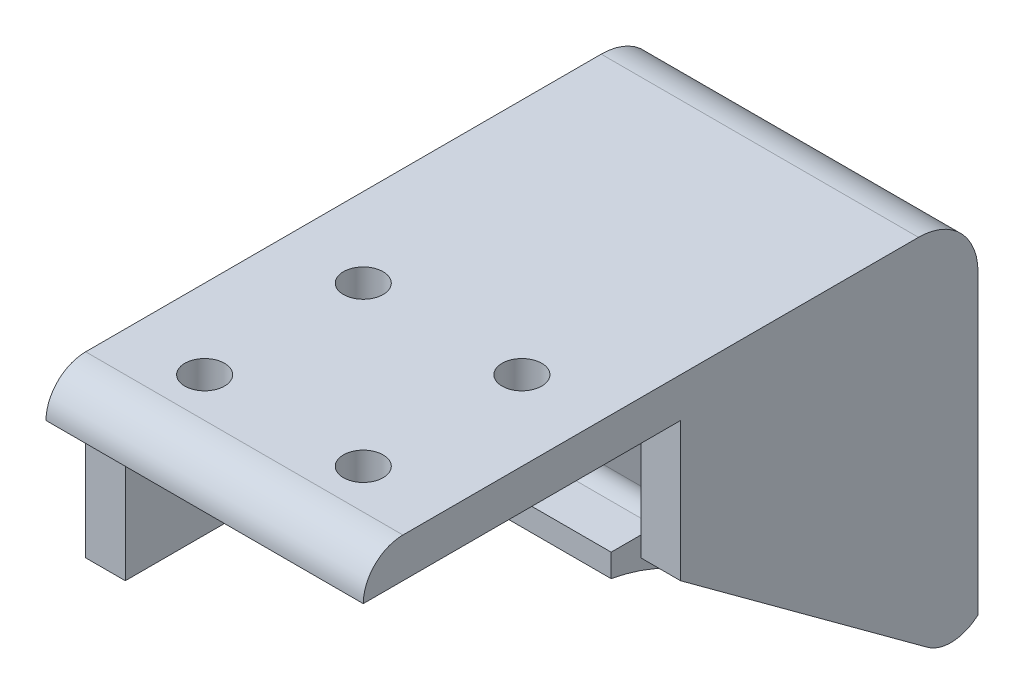
ISO-10303-21;
HEADER;
FILE_DESCRIPTION(('STEP AP214'),'2;1');
FILE_NAME('part.step','',(''),(''),'','','');
FILE_SCHEMA(('AUTOMOTIVE_DESIGN { 1 0 10303 214 1 1 1 1 }'));
ENDSEC;
DATA;
#1=APPLICATION_CONTEXT('core data for automotive mechanical design processes');
#2=APPLICATION_PROTOCOL_DEFINITION('international standard','automotive_design',2000,#1);
#3=PRODUCT_CONTEXT('',#1,'mechanical');
#4=PRODUCT('Part','Part','',(#3));
#5=PRODUCT_RELATED_PRODUCT_CATEGORY('part','',(#4));
#6=PRODUCT_DEFINITION_FORMATION('','',#4);
#7=PRODUCT_DEFINITION_CONTEXT('part definition',#1,'design');
#8=PRODUCT_DEFINITION('design','',#6,#7);
#9=PRODUCT_DEFINITION_SHAPE('','',#8);
#10=(LENGTH_UNIT() NAMED_UNIT(*) SI_UNIT(.MILLI.,.METRE.));
#11=(NAMED_UNIT(*) PLANE_ANGLE_UNIT() SI_UNIT($,.RADIAN.));
#12=(NAMED_UNIT(*) SI_UNIT($,.STERADIAN.) SOLID_ANGLE_UNIT());
#13=UNCERTAINTY_MEASURE_WITH_UNIT(LENGTH_MEASURE(1.E-05),#10,'distance_accuracy_value','');
#14=(GEOMETRIC_REPRESENTATION_CONTEXT(3) GLOBAL_UNCERTAINTY_ASSIGNED_CONTEXT((#13)) GLOBAL_UNIT_ASSIGNED_CONTEXT((#10,
#11,#12)) REPRESENTATION_CONTEXT('',''));
#15=CARTESIAN_POINT('',(0.,0.,0.));
#16=DIRECTION('',(0.,0.,1.));
#17=DIRECTION('',(1.,0.,0.));
#18=AXIS2_PLACEMENT_3D('',#15,#16,#17);
#19=CARTESIAN_POINT('',(0.,-13.0057803468208,-9.53757225433528));
#20=DIRECTION('',(0.,0.806404995855705,0.591363663627518));
#21=DIRECTION('',(0.,-0.591363663627518,0.806404995855705));
#22=AXIS2_PLACEMENT_3D('',#19,#20,#21);
#23=PLANE('',#22);
#24=DIRECTION('',(0.,-0.591363663627518,0.806404995855705));
#25=VECTOR('',#24,1.);
#26=CARTESIAN_POINT('',(16.,-13.0057803468208,-9.53757225433528));
#27=LINE('',#26,#25);
#28=CARTESIAN_POINT('',(16.,-9.,-15.));
#29=VERTEX_POINT('',#28);
#30=CARTESIAN_POINT('',(16.,-9.13266662667964,-14.8190909636187));
#31=VERTEX_POINT('',#30);
#32=EDGE_CURVE('E207',#29,#31,#27,.T.);
#33=ORIENTED_EDGE('',*,*,#32,.T.);
#34=DIRECTION('',(1.,0.,0.));
#35=VECTOR('',#34,1.);
#36=CARTESIAN_POINT('',(0.,-9.13266662667964,-14.8190909636187));
#37=LINE('',#36,#35);
#38=CARTESIAN_POINT('',(14.,-9.13266662667963,-14.8190909636187));
#39=VERTEX_POINT('',#38);
#40=EDGE_CURVE('E335',#31,#39,#37,.F.);
#41=ORIENTED_EDGE('',*,*,#40,.T.);
#42=DIRECTION('',(0.,-0.591363663627518,0.806404995855705));
#43=VECTOR('',#42,1.);
#44=CARTESIAN_POINT('',(14.,-13.0057803468208,-9.53757225433528));
#45=LINE('',#44,#43);
#46=CARTESIAN_POINT('',(14.,-9.,-15.));
#47=VERTEX_POINT('',#46);
#48=EDGE_CURVE('E219',#47,#39,#45,.T.);
#49=ORIENTED_EDGE('',*,*,#48,.F.);
#50=DIRECTION('',(1.,0.,0.));
#51=VECTOR('',#50,1.);
#52=CARTESIAN_POINT('',(0.,-9.,-15.));
#53=LINE('',#52,#51);
#54=EDGE_CURVE('E206',#47,#29,#53,.T.);
#55=ORIENTED_EDGE('',*,*,#54,.T.);
#56=EDGE_LOOP('',(#33,#41,#49,#55));
#57=FACE_BOUND('',#56,.T.);
#58=ADVANCED_FACE('F37',(#57),#23,.F.);
#59=CARTESIAN_POINT('',(14.,0.,0.));
#60=DIRECTION('',(1.,0.,0.));
#61=DIRECTION('',(0.,0.,-1.));
#62=AXIS2_PLACEMENT_3D('',#59,#60,#61);
#63=PLANE('',#62);
#64=DIRECTION('',(0.,0.,1.));
#65=VECTOR('',#64,1.);
#66=CARTESIAN_POINT('',(14.,1.,1.5));
#67=LINE('',#66,#65);
#68=CARTESIAN_POINT('',(14.,1.,-0.733333333333333));
#69=VERTEX_POINT('',#68);
#70=CARTESIAN_POINT('',(14.,1.,0.));
#71=VERTEX_POINT('',#70);
#72=EDGE_CURVE('E427',#69,#71,#67,.T.);
#73=ORIENTED_EDGE('',*,*,#72,.T.);
#74=DIRECTION('',(0.,-1.,0.));
#75=VECTOR('',#74,1.);
#76=CARTESIAN_POINT('',(14.,9.,0.));
#77=LINE('',#76,#75);
#78=CARTESIAN_POINT('',(14.,7.,0.));
#79=VERTEX_POINT('',#78);
#80=EDGE_CURVE('E235',#79,#71,#77,.T.);
#81=ORIENTED_EDGE('',*,*,#80,.F.);
#82=DIRECTION('',(0.,0.,-1.));
#83=VECTOR('',#82,1.);
#84=CARTESIAN_POINT('',(14.,7.,0.));
#85=LINE('',#84,#83);
#86=CARTESIAN_POINT('',(14.,7.,-13.));
#87=VERTEX_POINT('',#86);
#88=EDGE_CURVE('E226',#79,#87,#85,.T.);
#89=ORIENTED_EDGE('',*,*,#88,.T.);
#90=DIRECTION('',(0.,-1.,0.));
#91=VECTOR('',#90,1.);
#92=CARTESIAN_POINT('',(14.,7.,-13.));
#93=LINE('',#92,#91);
#94=CARTESIAN_POINT('',(14.,-7.05318996830156,-13.));
#95=VERTEX_POINT('',#94);
#96=EDGE_CURVE('E402',#87,#95,#93,.T.);
#97=ORIENTED_EDGE('',*,*,#96,.T.);
#98=DIRECTION('',(0.,0.591363663627517,0.806404995855705));
#99=VECTOR('',#98,1.);
#100=CARTESIAN_POINT('',(14.,1.61280999171141,-1.18272732725504));
#101=LINE('',#100,#99);
#102=CARTESIAN_POINT('',(14.,0.684873489111121,-2.44809528534634));
#103=VERTEX_POINT('',#102);
#104=EDGE_CURVE('E415',#95,#103,#101,.T.);
#105=ORIENTED_EDGE('',*,*,#104,.T.);
#106=CARTESIAN_POINT('',(14.,-0.927936502600291,-1.26536795809131));
#107=DIRECTION('',(1.,0.,0.));
#108=DIRECTION('',(0.,0.,-1.));
#109=AXIS2_PLACEMENT_3D('',#106,#107,#108);
#110=CIRCLE('',#109,2.);
#111=EDGE_CURVE('E327',#103,#69,#110,.T.);
#112=ORIENTED_EDGE('',*,*,#111,.T.);
#113=EDGE_LOOP('',(#73,#81,#89,#97,#105,#112));
#114=FACE_BOUND('',#113,.T.);
#115=ADVANCED_FACE('F473',(#114),#63,.F.);
#116=CARTESIAN_POINT('',(2.,7.,0.));
#117=DIRECTION('',(1.,0.,0.));
#118=DIRECTION('',(0.,0.,-1.));
#119=AXIS2_PLACEMENT_3D('',#116,#117,#118);
#120=PLANE('',#119);
#121=DIRECTION('',(0.,-0.806404995855706,0.591363663627517));
#122=VECTOR('',#121,1.);
#123=CARTESIAN_POINT('',(2.,-8.44037228995639,-14.891612256802));
#124=LINE('',#123,#122);
#125=CARTESIAN_POINT('',(2.,-9.,-14.4812186027701));
#126=VERTEX_POINT('',#125);
#127=CARTESIAN_POINT('',(2.,-9.4530454703318,-14.1489852578601));
#128=VERTEX_POINT('',#127);
#129=EDGE_CURVE('E344',#126,#128,#124,.T.);
#130=ORIENTED_EDGE('',*,*,#129,.T.);
#131=CARTESIAN_POINT('',(2.,-7.51985663496823,-13.6363636363636));
#132=DIRECTION('',(1.,0.,0.));
#133=DIRECTION('',(0.,0.,-1.));
#134=AXIS2_PLACEMENT_3D('',#131,#132,#133);
#135=CIRCLE('',#134,2.);
#136=CARTESIAN_POINT('',(2.,-9.13266662667964,-14.8190909636187));
#137=VERTEX_POINT('',#136);
#138=EDGE_CURVE('E45',#128,#137,#135,.T.);
#139=ORIENTED_EDGE('',*,*,#138,.T.);
#140=DIRECTION('',(0.,-0.591363663627518,0.806404995855705));
#141=VECTOR('',#140,1.);
#142=CARTESIAN_POINT('',(2.,-10.5578034682081,-12.8757225433526));
#143=LINE('',#142,#141);
#144=CARTESIAN_POINT('',(2.,-9.,-15.));
#145=VERTEX_POINT('',#144);
#146=EDGE_CURVE('E342',#145,#137,#143,.T.);
#147=ORIENTED_EDGE('',*,*,#146,.F.);
#148=DIRECTION('',(0.,0.,-1.));
#149=VECTOR('',#148,1.);
#150=CARTESIAN_POINT('',(2.,-9.,-13.));
#151=LINE('',#150,#149);
#152=EDGE_CURVE('E231',#126,#145,#151,.T.);
#153=ORIENTED_EDGE('',*,*,#152,.F.);
#154=EDGE_LOOP('',(#130,#139,#147,#153));
#155=FACE_BOUND('',#154,.T.);
#156=ADVANCED_FACE('F340',(#155),#120,.T.);
#157=ORIENTED_EDGE('',*,*,#48,.T.);
#158=CARTESIAN_POINT('',(14.,-7.51985663496823,-13.6363636363636));
#159=DIRECTION('',(1.,0.,0.));
#160=DIRECTION('',(0.,0.,-1.));
#161=AXIS2_PLACEMENT_3D('',#158,#159,#160);
#162=CIRCLE('',#161,2.);
#163=CARTESIAN_POINT('',(14.,-9.4530454703318,-14.1489852578601));
#164=VERTEX_POINT('',#163);
#165=EDGE_CURVE('E60',#39,#164,#162,.F.);
#166=ORIENTED_EDGE('',*,*,#165,.T.);
#167=DIRECTION('',(0.,-0.806404995855706,0.591363663627517));
#168=VECTOR('',#167,1.);
#169=CARTESIAN_POINT('',(14.,-8.44037228995638,-14.891612256802));
#170=LINE('',#169,#168);
#171=CARTESIAN_POINT('',(14.,-9.,-14.4812186027701));
#172=VERTEX_POINT('',#171);
#173=EDGE_CURVE('E397',#172,#164,#170,.T.);
#174=ORIENTED_EDGE('',*,*,#173,.F.);
#175=DIRECTION('',(0.,0.,-1.));
#176=VECTOR('',#175,1.);
#177=CARTESIAN_POINT('',(14.,-9.,-13.));
#178=LINE('',#177,#176);
#179=EDGE_CURVE('E395',#172,#47,#178,.T.);
#180=ORIENTED_EDGE('',*,*,#179,.T.);
#181=EDGE_LOOP('',(#157,#166,#174,#180));
#182=FACE_BOUND('',#181,.T.);
#183=ADVANCED_FACE('F396',(#182),#63,.F.);
#184=CARTESIAN_POINT('',(0.,7.,0.));
#185=DIRECTION('',(0.,1.,0.));
#186=DIRECTION('',(0.,0.,1.));
#187=AXIS2_PLACEMENT_3D('',#184,#185,#186);
#188=PLANE('',#187);
#189=CARTESIAN_POINT('',(4.,7.,4.));
#190=DIRECTION('',(0.,1.,0.));
#191=DIRECTION('',(0.,0.,1.));
#192=AXIS2_PLACEMENT_3D('',#189,#190,#191);
#193=CIRCLE('',#192,1.);
#194=CARTESIAN_POINT('',(4.,7.,5.));
#195=VERTEX_POINT('',#194);
#196=EDGE_CURVE('E439',#195,#195,#193,.F.);
#197=ORIENTED_EDGE('',*,*,#196,.F.);
#198=EDGE_LOOP('',(#197));
#199=FACE_BOUND('',#198,.T.);
#200=CARTESIAN_POINT('',(12.,7.,12.));
#201=DIRECTION('',(0.,1.,0.));
#202=DIRECTION('',(0.,0.,1.));
#203=AXIS2_PLACEMENT_3D('',#200,#201,#202);
#204=CIRCLE('',#203,1.);
#205=CARTESIAN_POINT('',(12.,7.,13.));
#206=VERTEX_POINT('',#205);
#207=EDGE_CURVE('E440',#206,#206,#204,.F.);
#208=ORIENTED_EDGE('',*,*,#207,.F.);
#209=EDGE_LOOP('',(#208));
#210=FACE_BOUND('',#209,.T.);
#211=CARTESIAN_POINT('',(12.,7.,4.));
#212=DIRECTION('',(0.,1.,0.));
#213=DIRECTION('',(0.,0.,1.));
#214=AXIS2_PLACEMENT_3D('',#211,#212,#213);
#215=CIRCLE('',#214,1.);
#216=CARTESIAN_POINT('',(12.,7.,5.));
#217=VERTEX_POINT('',#216);
#218=EDGE_CURVE('E447',#217,#217,#215,.F.);
#219=ORIENTED_EDGE('',*,*,#218,.F.);
#220=EDGE_LOOP('',(#219));
#221=FACE_BOUND('',#220,.T.);
#222=CARTESIAN_POINT('',(4.,7.,12.));
#223=DIRECTION('',(0.,1.,0.));
#224=DIRECTION('',(0.,0.,1.));
#225=AXIS2_PLACEMENT_3D('',#222,#223,#224);
#226=CIRCLE('',#225,1.);
#227=CARTESIAN_POINT('',(4.,7.,13.));
#228=VERTEX_POINT('',#227);
#229=EDGE_CURVE('E433',#228,#228,#226,.F.);
#230=ORIENTED_EDGE('',*,*,#229,.F.);
#231=EDGE_LOOP('',(#230));
#232=FACE_BOUND('',#231,.T.);
#233=DIRECTION('',(1.,0.,0.));
#234=VECTOR('',#233,1.);
#235=CARTESIAN_POINT('',(14.,7.,-13.));
#236=LINE('',#235,#234);
#237=CARTESIAN_POINT('',(2.,7.,-13.));
#238=VERTEX_POINT('',#237);
#239=EDGE_CURVE('E400',#238,#87,#236,.T.);
#240=ORIENTED_EDGE('',*,*,#239,.T.);
#241=ORIENTED_EDGE('',*,*,#88,.F.);
#242=DIRECTION('',(-1.,0.,0.));
#243=VECTOR('',#242,1.);
#244=CARTESIAN_POINT('',(0.,7.,0.));
#245=LINE('',#244,#243);
#246=CARTESIAN_POINT('',(16.,7.,0.));
#247=VERTEX_POINT('',#246);
#248=EDGE_CURVE('E252',#247,#79,#245,.T.);
#249=ORIENTED_EDGE('',*,*,#248,.F.);
#250=DIRECTION('',(0.,0.,-1.));
#251=VECTOR('',#250,1.);
#252=CARTESIAN_POINT('',(16.,7.,0.));
#253=LINE('',#252,#251);
#254=CARTESIAN_POINT('',(16.,7.,16.));
#255=VERTEX_POINT('',#254);
#256=EDGE_CURVE('E259',#255,#247,#253,.T.);
#257=ORIENTED_EDGE('',*,*,#256,.F.);
#258=DIRECTION('',(1.,0.,0.));
#259=VECTOR('',#258,1.);
#260=CARTESIAN_POINT('',(0.,7.,16.));
#261=LINE('',#260,#259);
#262=CARTESIAN_POINT('',(0.,7.,16.));
#263=VERTEX_POINT('',#262);
#264=EDGE_CURVE('E256',#263,#255,#261,.T.);
#265=ORIENTED_EDGE('',*,*,#264,.F.);
#266=DIRECTION('',(0.,0.,1.));
#267=VECTOR('',#266,1.);
#268=CARTESIAN_POINT('',(0.,7.,0.));
#269=LINE('',#268,#267);
#270=CARTESIAN_POINT('',(0.,7.,14.));
#271=VERTEX_POINT('',#270);
#272=EDGE_CURVE('E247',#271,#263,#269,.T.);
#273=ORIENTED_EDGE('',*,*,#272,.F.);
#274=DIRECTION('',(1.,0.,0.));
#275=VECTOR('',#274,1.);
#276=CARTESIAN_POINT('',(0.,7.,14.));
#277=LINE('',#276,#275);
#278=CARTESIAN_POINT('',(2.,7.,14.));
#279=VERTEX_POINT('',#278);
#280=EDGE_CURVE('E266',#271,#279,#277,.T.);
#281=ORIENTED_EDGE('',*,*,#280,.T.);
#282=DIRECTION('',(0.,0.,1.));
#283=VECTOR('',#282,1.);
#284=CARTESIAN_POINT('',(2.,7.,0.));
#285=LINE('',#284,#283);
#286=EDGE_CURVE('E264',#238,#279,#285,.T.);
#287=ORIENTED_EDGE('',*,*,#286,.F.);
#288=EDGE_LOOP('',(#240,#241,#249,#257,#265,#273,#281,#287));
#289=FACE_BOUND('',#288,.T.);
#290=ADVANCED_FACE('F375',(#199,#210,#221,#232,#289),#188,.F.);
#291=DIRECTION('',(0.,-1.,0.));
#292=VECTOR('',#291,1.);
#293=CARTESIAN_POINT('',(2.,1.,1.5));
#294=LINE('',#293,#292);
#295=CARTESIAN_POINT('',(2.,1.,1.5));
#296=VERTEX_POINT('',#295);
#297=CARTESIAN_POINT('',(2.,-0.15855846845862,1.5));
#298=VERTEX_POINT('',#297);
#299=EDGE_CURVE('E420',#296,#298,#294,.T.);
#300=ORIENTED_EDGE('',*,*,#299,.F.);
#301=DIRECTION('',(0.,0.,-1.));
#302=VECTOR('',#301,1.);
#303=CARTESIAN_POINT('',(2.,1.,1.5));
#304=LINE('',#303,#302);
#305=CARTESIAN_POINT('',(2.,1.,-0.733333333333333));
#306=VERTEX_POINT('',#305);
#307=EDGE_CURVE('E430',#296,#306,#304,.T.);
#308=ORIENTED_EDGE('',*,*,#307,.T.);
#309=CARTESIAN_POINT('',(2.,-0.927936502600291,-1.2653679580913));
#310=DIRECTION('',(1.,0.,0.));
#311=DIRECTION('',(0.,0.,-1.));
#312=AXIS2_PLACEMENT_3D('',#309,#310,#311);
#313=CIRCLE('',#312,2.);
#314=CARTESIAN_POINT('',(2.,0.684873489111121,-2.44809528534634));
#315=VERTEX_POINT('',#314);
#316=EDGE_CURVE('E325',#306,#315,#313,.F.);
#317=ORIENTED_EDGE('',*,*,#316,.T.);
#318=DIRECTION('',(0.,-0.591363663627517,-0.806404995855706));
#319=VECTOR('',#318,1.);
#320=CARTESIAN_POINT('',(2.,1.61280999171141,-1.18272732725503));
#321=LINE('',#320,#319);
#322=CARTESIAN_POINT('',(2.,-7.05318996830156,-13.));
#323=VERTEX_POINT('',#322);
#324=EDGE_CURVE('E412',#315,#323,#321,.T.);
#325=ORIENTED_EDGE('',*,*,#324,.T.);
#326=DIRECTION('',(0.,1.,0.));
#327=VECTOR('',#326,1.);
#328=CARTESIAN_POINT('',(2.,7.,-13.));
#329=LINE('',#328,#327);
#330=EDGE_CURVE('E405',#323,#238,#329,.T.);
#331=ORIENTED_EDGE('',*,*,#330,.T.);
#332=ORIENTED_EDGE('',*,*,#286,.T.);
#333=DIRECTION('',(0.,-1.,0.));
#334=VECTOR('',#333,1.);
#335=CARTESIAN_POINT('',(2.,7.,14.));
#336=LINE('',#335,#334);
#337=CARTESIAN_POINT('',(2.,0.,14.));
#338=VERTEX_POINT('',#337);
#339=EDGE_CURVE('E270',#279,#338,#336,.T.);
#340=ORIENTED_EDGE('',*,*,#339,.T.);
#341=DIRECTION('',(0.,0.,1.));
#342=VECTOR('',#341,1.);
#343=CARTESIAN_POINT('',(2.,0.,0.));
#344=LINE('',#343,#342);
#345=CARTESIAN_POINT('',(2.,0.,3.27370476158025));
#346=VERTEX_POINT('',#345);
#347=EDGE_CURVE('E254',#346,#338,#344,.T.);
#348=ORIENTED_EDGE('',*,*,#347,.F.);
#349=CARTESIAN_POINT('',(2.,-10.,3.27370476158025));
#350=DIRECTION('',(1.,0.,0.));
#351=DIRECTION('',(0.,0.,-1.));
#352=AXIS2_PLACEMENT_3D('',#349,#350,#351);
#353=CIRCLE('',#352,10.);
#354=EDGE_CURVE('E306',#346,#298,#353,.F.);
#355=ORIENTED_EDGE('',*,*,#354,.T.);
#356=EDGE_LOOP('',(#300,#308,#317,#325,#331,#332,#340,#348,#355));
#357=FACE_BOUND('',#356,.T.);
#358=ADVANCED_FACE('F480',(#357),#120,.T.);
#359=CARTESIAN_POINT('',(0.,7.,0.));
#360=DIRECTION('',(1.,0.,0.));
#361=DIRECTION('',(0.,0.,-1.));
#362=AXIS2_PLACEMENT_3D('',#359,#360,#361);
#363=PLANE('',#362);
#364=DIRECTION('',(0.,-0.591363663627518,0.806404995855705));
#365=VECTOR('',#364,1.);
#366=CARTESIAN_POINT('',(0.,-13.0057803468208,-9.53757225433528));
#367=LINE('',#366,#365);
#368=CARTESIAN_POINT('',(0.,-9.,-15.));
#369=VERTEX_POINT('',#368);
#370=CARTESIAN_POINT('',(0.,-9.13266662667964,-14.8190909636187));
#371=VERTEX_POINT('',#370);
#372=EDGE_CURVE('E195',#369,#371,#367,.T.);
#373=ORIENTED_EDGE('',*,*,#372,.T.);
#374=CARTESIAN_POINT('',(0.,-7.51985663496823,-13.6363636363636));
#375=DIRECTION('',(1.,0.,0.));
#376=DIRECTION('',(0.,0.,-1.));
#377=AXIS2_PLACEMENT_3D('',#374,#375,#376);
#378=CIRCLE('',#377,2.);
#379=CARTESIAN_POINT('',(0.,-9.13266662667964,-12.4536363091086));
#380=VERTEX_POINT('',#379);
#381=EDGE_CURVE('E11',#371,#380,#378,.F.);
#382=ORIENTED_EDGE('',*,*,#381,.T.);
#383=DIRECTION('',(0.,0.591363663627517,0.806404995855706));
#384=VECTOR('',#383,1.);
#385=CARTESIAN_POINT('',(0.,-11.,-15.));
#386=LINE('',#385,#384);
#387=CARTESIAN_POINT('',(0.,-1.93595004144294,-2.63993187469492));
#388=VERTEX_POINT('',#387);
#389=EDGE_CURVE('E225',#380,#388,#386,.T.);
#390=ORIENTED_EDGE('',*,*,#389,.T.);
#391=CARTESIAN_POINT('',(0.,-10.,3.27370476158025));
#392=DIRECTION('',(1.,0.,0.));
#393=DIRECTION('',(0.,0.,-1.));
#394=AXIS2_PLACEMENT_3D('',#391,#392,#393);
#395=CIRCLE('',#394,10.);
#396=CARTESIAN_POINT('',(0.,0.,3.27370476158025));
#397=VERTEX_POINT('',#396);
#398=EDGE_CURVE('E314',#388,#397,#395,.T.);
#399=ORIENTED_EDGE('',*,*,#398,.T.);
#400=DIRECTION('',(0.,0.,1.));
#401=VECTOR('',#400,1.);
#402=CARTESIAN_POINT('',(0.,0.,0.));
#403=LINE('',#402,#401);
#404=CARTESIAN_POINT('',(0.,0.,14.));
#405=VERTEX_POINT('',#404);
#406=EDGE_CURVE('E267',#397,#405,#403,.T.);
#407=ORIENTED_EDGE('',*,*,#406,.T.);
#408=DIRECTION('',(0.,-1.,0.));
#409=VECTOR('',#408,1.);
#410=CARTESIAN_POINT('',(0.,7.,14.));
#411=LINE('',#410,#409);
#412=EDGE_CURVE('E276',#271,#405,#411,.T.);
#413=ORIENTED_EDGE('',*,*,#412,.F.);
#414=ORIENTED_EDGE('',*,*,#272,.T.);
#415=CARTESIAN_POINT('',(0.,7.,14.));
#416=DIRECTION('',(1.,0.,0.));
#417=DIRECTION('',(0.,0.,-1.));
#418=AXIS2_PLACEMENT_3D('',#415,#416,#417);
#419=CIRCLE('',#418,2.);
#420=CARTESIAN_POINT('',(0.,9.,14.));
#421=VERTEX_POINT('',#420);
#422=EDGE_CURVE('E321',#263,#421,#419,.F.);
#423=ORIENTED_EDGE('',*,*,#422,.T.);
#424=DIRECTION('',(0.,0.,1.));
#425=VECTOR('',#424,1.);
#426=CARTESIAN_POINT('',(0.,9.,0.));
#427=LINE('',#426,#425);
#428=CARTESIAN_POINT('',(0.,9.,-12.));
#429=VERTEX_POINT('',#428);
#430=EDGE_CURVE('E248',#429,#421,#427,.T.);
#431=ORIENTED_EDGE('',*,*,#430,.F.);
#432=CARTESIAN_POINT('',(0.,6.,-12.));
#433=DIRECTION('',(1.,0.,0.));
#434=DIRECTION('',(0.,0.,-1.));
#435=AXIS2_PLACEMENT_3D('',#432,#433,#434);
#436=CIRCLE('',#435,3.);
#437=CARTESIAN_POINT('',(0.,6.,-15.));
#438=VERTEX_POINT('',#437);
#439=EDGE_CURVE('E224',#429,#438,#436,.F.);
#440=ORIENTED_EDGE('',*,*,#439,.T.);
#441=DIRECTION('',(0.,-1.,0.));
#442=VECTOR('',#441,1.);
#443=CARTESIAN_POINT('',(0.,9.,-15.));
#444=LINE('',#443,#442);
#445=EDGE_CURVE('E214',#438,#369,#444,.T.);
#446=ORIENTED_EDGE('',*,*,#445,.T.);
#447=EDGE_LOOP('',(#373,#382,#390,#399,#407,#413,#414,#423,#431,#440,#446));
#448=FACE_BOUND('',#447,.T.);
#449=ADVANCED_FACE('F221',(#448),#363,.F.);
#450=CARTESIAN_POINT('',(0.,7.,14.));
#451=DIRECTION('',(0.,0.,-1.));
#452=DIRECTION('',(-1.,0.,0.));
#453=AXIS2_PLACEMENT_3D('',#450,#451,#452);
#454=PLANE('',#453);
#455=DIRECTION('',(1.,0.,0.));
#456=VECTOR('',#455,1.);
#457=CARTESIAN_POINT('',(0.,0.,14.));
#458=LINE('',#457,#456);
#459=EDGE_CURVE('E272',#405,#338,#458,.T.);
#460=ORIENTED_EDGE('',*,*,#459,.T.);
#461=ORIENTED_EDGE('',*,*,#339,.F.);
#462=ORIENTED_EDGE('',*,*,#280,.F.);
#463=ORIENTED_EDGE('',*,*,#412,.T.);
#464=EDGE_LOOP('',(#460,#461,#462,#463));
#465=FACE_BOUND('',#464,.T.);
#466=ADVANCED_FACE('F367',(#465),#454,.F.);
#467=CARTESIAN_POINT('',(0.,0.,0.));
#468=DIRECTION('',(0.,1.,0.));
#469=DIRECTION('',(0.,0.,1.));
#470=AXIS2_PLACEMENT_3D('',#467,#468,#469);
#471=PLANE('',#470);
#472=ORIENTED_EDGE('',*,*,#406,.F.);
#473=DIRECTION('',(1.,0.,0.));
#474=VECTOR('',#473,1.);
#475=CARTESIAN_POINT('',(0.,0.,3.27370476158025));
#476=LINE('',#475,#474);
#477=EDGE_CURVE('E297',#397,#346,#476,.T.);
#478=ORIENTED_EDGE('',*,*,#477,.T.);
#479=ORIENTED_EDGE('',*,*,#347,.T.);
#480=ORIENTED_EDGE('',*,*,#459,.F.);
#481=EDGE_LOOP('',(#472,#478,#479,#480));
#482=FACE_BOUND('',#481,.T.);
#483=ADVANCED_FACE('F363',(#482),#471,.F.);
#484=CARTESIAN_POINT('',(16.,9.,0.));
#485=DIRECTION('',(-1.,0.,0.));
#486=DIRECTION('',(0.,0.,1.));
#487=AXIS2_PLACEMENT_3D('',#484,#485,#486);
#488=PLANE('',#487);
#489=DIRECTION('',(0.,-0.591363663627517,-0.806404995855706));
#490=VECTOR('',#489,1.);
#491=CARTESIAN_POINT('',(16.,0.,0.));
#492=LINE('',#491,#490);
#493=CARTESIAN_POINT('',(16.,0.,0.));
#494=VERTEX_POINT('',#493);
#495=CARTESIAN_POINT('',(16.,-9.13266662667964,-12.4536363091086));
#496=VERTEX_POINT('',#495);
#497=EDGE_CURVE('E241',#494,#496,#492,.T.);
#498=ORIENTED_EDGE('',*,*,#497,.T.);
#499=CARTESIAN_POINT('',(16.,-7.51985663496823,-13.6363636363636));
#500=DIRECTION('',(-1.,0.,0.));
#501=DIRECTION('',(0.,0.,1.));
#502=AXIS2_PLACEMENT_3D('',#499,#500,#501);
#503=CIRCLE('',#502,2.);
#504=EDGE_CURVE('E332',#496,#31,#503,.F.);
#505=ORIENTED_EDGE('',*,*,#504,.T.);
#506=ORIENTED_EDGE('',*,*,#32,.F.);
#507=DIRECTION('',(0.,1.,0.));
#508=VECTOR('',#507,1.);
#509=CARTESIAN_POINT('',(16.,9.,-15.));
#510=LINE('',#509,#508);
#511=CARTESIAN_POINT('',(16.,6.,-15.));
#512=VERTEX_POINT('',#511);
#513=EDGE_CURVE('E239',#29,#512,#510,.T.);
#514=ORIENTED_EDGE('',*,*,#513,.T.);
#515=CARTESIAN_POINT('',(16.,6.,-12.));
#516=DIRECTION('',(-1.,0.,0.));
#517=DIRECTION('',(0.,0.,1.));
#518=AXIS2_PLACEMENT_3D('',#515,#516,#517);
#519=CIRCLE('',#518,3.);
#520=CARTESIAN_POINT('',(16.,9.,-12.));
#521=VERTEX_POINT('',#520);
#522=EDGE_CURVE('E291',#512,#521,#519,.F.);
#523=ORIENTED_EDGE('',*,*,#522,.T.);
#524=DIRECTION('',(0.,0.,-1.));
#525=VECTOR('',#524,1.);
#526=CARTESIAN_POINT('',(16.,9.,0.));
#527=LINE('',#526,#525);
#528=CARTESIAN_POINT('',(16.,9.,14.));
#529=VERTEX_POINT('',#528);
#530=EDGE_CURVE('E251',#529,#521,#527,.T.);
#531=ORIENTED_EDGE('',*,*,#530,.F.);
#532=CARTESIAN_POINT('',(16.,7.,14.));
#533=DIRECTION('',(-1.,0.,0.));
#534=DIRECTION('',(0.,0.,1.));
#535=AXIS2_PLACEMENT_3D('',#532,#533,#534);
#536=CIRCLE('',#535,2.);
#537=EDGE_CURVE('E319',#529,#255,#536,.F.);
#538=ORIENTED_EDGE('',*,*,#537,.T.);
#539=ORIENTED_EDGE('',*,*,#256,.T.);
#540=DIRECTION('',(0.,-1.,0.));
#541=VECTOR('',#540,1.);
#542=CARTESIAN_POINT('',(16.,9.,0.));
#543=LINE('',#542,#541);
#544=EDGE_CURVE('E228',#247,#494,#543,.T.);
#545=ORIENTED_EDGE('',*,*,#544,.T.);
#546=EDGE_LOOP('',(#498,#505,#506,#514,#523,#531,#538,#539,#545));
#547=FACE_BOUND('',#546,.T.);
#548=ADVANCED_FACE('F384',(#547),#488,.F.);
#549=CARTESIAN_POINT('',(0.,9.,0.));
#550=DIRECTION('',(0.,1.,0.));
#551=DIRECTION('',(0.,0.,1.));
#552=AXIS2_PLACEMENT_3D('',#549,#550,#551);
#553=PLANE('',#552);
#554=CARTESIAN_POINT('',(4.,9.,4.));
#555=DIRECTION('',(0.,1.,0.));
#556=DIRECTION('',(0.,0.,1.));
#557=AXIS2_PLACEMENT_3D('',#554,#555,#556);
#558=CIRCLE('',#557,1.);
#559=CARTESIAN_POINT('',(4.,9.,5.));
#560=VERTEX_POINT('',#559);
#561=EDGE_CURVE('E443',#560,#560,#558,.T.);
#562=ORIENTED_EDGE('',*,*,#561,.F.);
#563=EDGE_LOOP('',(#562));
#564=FACE_BOUND('',#563,.T.);
#565=CARTESIAN_POINT('',(12.,9.,12.));
#566=DIRECTION('',(0.,1.,0.));
#567=DIRECTION('',(0.,0.,1.));
#568=AXIS2_PLACEMENT_3D('',#565,#566,#567);
#569=CIRCLE('',#568,1.);
#570=CARTESIAN_POINT('',(12.,9.,13.));
#571=VERTEX_POINT('',#570);
#572=EDGE_CURVE('E444',#571,#571,#569,.T.);
#573=ORIENTED_EDGE('',*,*,#572,.F.);
#574=EDGE_LOOP('',(#573));
#575=FACE_BOUND('',#574,.T.);
#576=CARTESIAN_POINT('',(12.,9.,4.));
#577=DIRECTION('',(0.,1.,0.));
#578=DIRECTION('',(0.,0.,1.));
#579=AXIS2_PLACEMENT_3D('',#576,#577,#578);
#580=CIRCLE('',#579,1.);
#581=CARTESIAN_POINT('',(12.,9.,5.));
#582=VERTEX_POINT('',#581);
#583=EDGE_CURVE('E346',#582,#582,#580,.T.);
#584=ORIENTED_EDGE('',*,*,#583,.F.);
#585=EDGE_LOOP('',(#584));
#586=FACE_BOUND('',#585,.T.);
#587=CARTESIAN_POINT('',(4.,9.,12.));
#588=DIRECTION('',(0.,1.,0.));
#589=DIRECTION('',(0.,0.,1.));
#590=AXIS2_PLACEMENT_3D('',#587,#588,#589);
#591=CIRCLE('',#590,1.);
#592=CARTESIAN_POINT('',(4.,9.,13.));
#593=VERTEX_POINT('',#592);
#594=EDGE_CURVE('E436',#593,#593,#591,.T.);
#595=ORIENTED_EDGE('',*,*,#594,.F.);
#596=EDGE_LOOP('',(#595));
#597=FACE_BOUND('',#596,.T.);
#598=ORIENTED_EDGE('',*,*,#430,.T.);
#599=DIRECTION('',(1.,0.,0.));
#600=VECTOR('',#599,1.);
#601=CARTESIAN_POINT('',(16.,9.,14.));
#602=LINE('',#601,#600);
#603=EDGE_CURVE('E316',#421,#529,#602,.T.);
#604=ORIENTED_EDGE('',*,*,#603,.T.);
#605=ORIENTED_EDGE('',*,*,#530,.T.);
#606=DIRECTION('',(1.,0.,0.));
#607=VECTOR('',#606,1.);
#608=CARTESIAN_POINT('',(0.,9.,-12.));
#609=LINE('',#608,#607);
#610=EDGE_CURVE('E294',#521,#429,#609,.F.);
#611=ORIENTED_EDGE('',*,*,#610,.T.);
#612=EDGE_LOOP('',(#598,#604,#605,#611));
#613=FACE_BOUND('',#612,.T.);
#614=ADVANCED_FACE('F382',(#564,#575,#586,#597,#613),#553,.T.);
#615=CARTESIAN_POINT('',(14.,9.,0.));
#616=DIRECTION('',(0.,0.,1.));
#617=DIRECTION('',(1.,0.,0.));
#618=AXIS2_PLACEMENT_3D('',#615,#616,#617);
#619=PLANE('',#618);
#620=ORIENTED_EDGE('',*,*,#544,.F.);
#621=ORIENTED_EDGE('',*,*,#248,.T.);
#622=ORIENTED_EDGE('',*,*,#80,.T.);
#623=DIRECTION('',(0.,1.,0.));
#624=VECTOR('',#623,1.);
#625=CARTESIAN_POINT('',(14.,9.,0.));
#626=LINE('',#625,#624);
#627=CARTESIAN_POINT('',(14.,0.,0.));
#628=VERTEX_POINT('',#627);
#629=EDGE_CURVE('E418',#628,#71,#626,.T.);
#630=ORIENTED_EDGE('',*,*,#629,.F.);
#631=DIRECTION('',(1.,0.,0.));
#632=VECTOR('',#631,1.);
#633=CARTESIAN_POINT('',(14.,0.,0.));
#634=LINE('',#633,#632);
#635=EDGE_CURVE('E238',#628,#494,#634,.T.);
#636=ORIENTED_EDGE('',*,*,#635,.T.);
#637=EDGE_LOOP('',(#620,#621,#622,#630,#636));
#638=FACE_BOUND('',#637,.T.);
#639=ADVANCED_FACE('F460',(#638),#619,.T.);
#640=CARTESIAN_POINT('',(14.,9.,-15.));
#641=DIRECTION('',(0.,0.,-1.));
#642=DIRECTION('',(-1.,0.,0.));
#643=AXIS2_PLACEMENT_3D('',#640,#641,#642);
#644=PLANE('',#643);
#645=EDGE_CURVE('E199',#369,#145,#53,.T.);
#646=ORIENTED_EDGE('',*,*,#645,.F.);
#647=ORIENTED_EDGE('',*,*,#445,.F.);
#648=DIRECTION('',(1.,0.,0.));
#649=VECTOR('',#648,1.);
#650=CARTESIAN_POINT('',(14.,6.,-15.));
#651=LINE('',#650,#649);
#652=EDGE_CURVE('E289',#438,#512,#651,.T.);
#653=ORIENTED_EDGE('',*,*,#652,.T.);
#654=ORIENTED_EDGE('',*,*,#513,.F.);
#655=ORIENTED_EDGE('',*,*,#54,.F.);
#656=DIRECTION('',(-1.,0.,0.));
#657=VECTOR('',#656,1.);
#658=CARTESIAN_POINT('',(14.,-9.,-15.));
#659=LINE('',#658,#657);
#660=EDGE_CURVE('E218',#47,#145,#659,.T.);
#661=ORIENTED_EDGE('',*,*,#660,.T.);
#662=EDGE_LOOP('',(#646,#647,#653,#654,#655,#661));
#663=FACE_BOUND('',#662,.T.);
#664=ADVANCED_FACE('F212',(#663),#644,.T.);
#665=CARTESIAN_POINT('',(14.,0.,0.));
#666=DIRECTION('',(0.,-0.806404995855706,0.591363663627517));
#667=DIRECTION('',(0.,-0.591363663627517,-0.806404995855706));
#668=AXIS2_PLACEMENT_3D('',#665,#666,#667);
#669=PLANE('',#668);
#670=ORIENTED_EDGE('',*,*,#389,.F.);
#671=DIRECTION('',(1.,0.,0.));
#672=VECTOR('',#671,1.);
#673=CARTESIAN_POINT('',(16.,-9.13266662667964,-12.4536363091086));
#674=LINE('',#673,#672);
#675=EDGE_CURVE('E329',#380,#496,#674,.T.);
#676=ORIENTED_EDGE('',*,*,#675,.T.);
#677=ORIENTED_EDGE('',*,*,#497,.F.);
#678=ORIENTED_EDGE('',*,*,#635,.F.);
#679=DIRECTION('',(0.,-0.591363663627517,-0.806404995855706));
#680=VECTOR('',#679,1.);
#681=CARTESIAN_POINT('',(14.,1.0650289017341,1.45231213872832));
#682=LINE('',#681,#680);
#683=CARTESIAN_POINT('',(14.,-1.93595004144294,-2.63993187469492));
#684=VERTEX_POINT('',#683);
#685=EDGE_CURVE('E303',#628,#684,#682,.T.);
#686=ORIENTED_EDGE('',*,*,#685,.T.);
#687=DIRECTION('',(1.,0.,0.));
#688=VECTOR('',#687,1.);
#689=CARTESIAN_POINT('',(14.,-1.93595004144294,-2.63993187469492));
#690=LINE('',#689,#688);
#691=EDGE_CURVE('E300',#684,#388,#690,.F.);
#692=ORIENTED_EDGE('',*,*,#691,.T.);
#693=EDGE_LOOP('',(#670,#676,#677,#678,#686,#692));
#694=FACE_BOUND('',#693,.T.);
#695=ADVANCED_FACE('F351',(#694),#669,.T.);
#696=CARTESIAN_POINT('',(14.,-9.,-13.));
#697=DIRECTION('',(0.,-1.,0.));
#698=DIRECTION('',(0.,0.,-1.));
#699=AXIS2_PLACEMENT_3D('',#696,#697,#698);
#700=PLANE('',#699);
#701=DIRECTION('',(1.,0.,0.));
#702=VECTOR('',#701,1.);
#703=CARTESIAN_POINT('',(14.,-9.,-14.48121860277));
#704=LINE('',#703,#702);
#705=EDGE_CURVE('E284',#126,#172,#704,.T.);
#706=ORIENTED_EDGE('',*,*,#705,.F.);
#707=ORIENTED_EDGE('',*,*,#152,.T.);
#708=ORIENTED_EDGE('',*,*,#660,.F.);
#709=ORIENTED_EDGE('',*,*,#179,.F.);
#710=EDGE_LOOP('',(#706,#707,#708,#709));
#711=FACE_BOUND('',#710,.T.);
#712=ADVANCED_FACE('F401',(#711),#700,.T.);
#713=CARTESIAN_POINT('',(0.,0.,-13.));
#714=DIRECTION('',(0.,0.,-1.));
#715=DIRECTION('',(-1.,0.,0.));
#716=AXIS2_PLACEMENT_3D('',#713,#714,#715);
#717=PLANE('',#716);
#718=ORIENTED_EDGE('',*,*,#330,.F.);
#719=DIRECTION('',(1.,0.,0.));
#720=VECTOR('',#719,1.);
#721=CARTESIAN_POINT('',(0.,-7.05318996830156,-13.));
#722=LINE('',#721,#720);
#723=EDGE_CURVE('E279',#323,#95,#722,.T.);
#724=ORIENTED_EDGE('',*,*,#723,.T.);
#725=ORIENTED_EDGE('',*,*,#96,.F.);
#726=ORIENTED_EDGE('',*,*,#239,.F.);
#727=EDGE_LOOP('',(#718,#724,#725,#726));
#728=FACE_BOUND('',#727,.T.);
#729=ADVANCED_FACE('F547',(#728),#717,.F.);
#730=CARTESIAN_POINT('',(0.,1.61280999171141,-1.18272732725503));
#731=DIRECTION('',(0.,0.806404995855706,-0.591363663627517));
#732=DIRECTION('',(0.,0.591363663627517,0.806404995855706));
#733=AXIS2_PLACEMENT_3D('',#730,#731,#732);
#734=PLANE('',#733);
#735=ORIENTED_EDGE('',*,*,#324,.F.);
#736=DIRECTION('',(-1.,0.,0.));
#737=VECTOR('',#736,1.);
#738=CARTESIAN_POINT('',(14.,0.68487348911112,-2.44809528534634));
#739=LINE('',#738,#737);
#740=EDGE_CURVE('E323',#315,#103,#739,.F.);
#741=ORIENTED_EDGE('',*,*,#740,.T.);
#742=ORIENTED_EDGE('',*,*,#104,.F.);
#743=ORIENTED_EDGE('',*,*,#723,.F.);
#744=EDGE_LOOP('',(#735,#741,#742,#743));
#745=FACE_BOUND('',#744,.T.);
#746=ADVANCED_FACE('F493',(#745),#734,.T.);
#747=CARTESIAN_POINT('',(14.,-8.44037228995638,-14.891612256802));
#748=DIRECTION('',(0.,-0.591363663627517,-0.806404995855706));
#749=DIRECTION('',(0.,0.806404995855706,-0.591363663627517));
#750=AXIS2_PLACEMENT_3D('',#747,#748,#749);
#751=PLANE('',#750);
#752=ORIENTED_EDGE('',*,*,#173,.T.);
#753=DIRECTION('',(-1.,0.,0.));
#754=VECTOR('',#753,1.);
#755=CARTESIAN_POINT('',(14.,-9.4530454703318,-14.1489852578601));
#756=LINE('',#755,#754);
#757=EDGE_CURVE('E52',#164,#128,#756,.T.);
#758=ORIENTED_EDGE('',*,*,#757,.T.);
#759=ORIENTED_EDGE('',*,*,#129,.F.);
#760=ORIENTED_EDGE('',*,*,#705,.T.);
#761=EDGE_LOOP('',(#752,#758,#759,#760));
#762=FACE_BOUND('',#761,.T.);
#763=ADVANCED_FACE('F486',(#762),#751,.T.);
#764=CARTESIAN_POINT('',(2.,1.,1.5));
#765=DIRECTION('',(0.,0.,1.));
#766=DIRECTION('',(1.,0.,0.));
#767=AXIS2_PLACEMENT_3D('',#764,#765,#766);
#768=PLANE('',#767);
#769=ORIENTED_EDGE('',*,*,#299,.T.);
#770=DIRECTION('',(1.,0.,0.));
#771=VECTOR('',#770,1.);
#772=CARTESIAN_POINT('',(2.,-0.15855846845862,1.5));
#773=LINE('',#772,#771);
#774=CARTESIAN_POINT('',(14.,-0.15855846845862,1.5));
#775=VERTEX_POINT('',#774);
#776=EDGE_CURVE('E309',#298,#775,#773,.T.);
#777=ORIENTED_EDGE('',*,*,#776,.T.);
#778=DIRECTION('',(0.,-1.,0.));
#779=VECTOR('',#778,1.);
#780=CARTESIAN_POINT('',(14.,1.,1.5));
#781=LINE('',#780,#779);
#782=CARTESIAN_POINT('',(14.,1.,1.5));
#783=VERTEX_POINT('',#782);
#784=EDGE_CURVE('E421',#783,#775,#781,.T.);
#785=ORIENTED_EDGE('',*,*,#784,.F.);
#786=DIRECTION('',(-1.,0.,0.));
#787=VECTOR('',#786,1.);
#788=CARTESIAN_POINT('',(2.,1.,1.5));
#789=LINE('',#788,#787);
#790=EDGE_CURVE('E423',#783,#296,#789,.T.);
#791=ORIENTED_EDGE('',*,*,#790,.T.);
#792=EDGE_LOOP('',(#769,#777,#785,#791));
#793=FACE_BOUND('',#792,.T.);
#794=ADVANCED_FACE('F484',(#793),#768,.T.);
#795=CARTESIAN_POINT('',(14.,1.,1.5));
#796=DIRECTION('',(1.,0.,0.));
#797=DIRECTION('',(0.,0.,-1.));
#798=AXIS2_PLACEMENT_3D('',#795,#796,#797);
#799=PLANE('',#798);
#800=ORIENTED_EDGE('',*,*,#784,.T.);
#801=CARTESIAN_POINT('',(14.,-10.,3.27370476158025));
#802=DIRECTION('',(1.,0.,0.));
#803=DIRECTION('',(0.,0.,-1.));
#804=AXIS2_PLACEMENT_3D('',#801,#802,#803);
#805=CIRCLE('',#804,10.);
#806=EDGE_CURVE('E312',#775,#684,#805,.F.);
#807=ORIENTED_EDGE('',*,*,#806,.T.);
#808=ORIENTED_EDGE('',*,*,#685,.F.);
#809=ORIENTED_EDGE('',*,*,#629,.T.);
#810=EDGE_CURVE('E428',#71,#783,#67,.T.);
#811=ORIENTED_EDGE('',*,*,#810,.T.);
#812=EDGE_LOOP('',(#800,#807,#808,#809,#811));
#813=FACE_BOUND('',#812,.T.);
#814=ADVANCED_FACE('F464',(#813),#799,.T.);
#815=CARTESIAN_POINT('',(0.,1.,0.));
#816=DIRECTION('',(0.,-1.,0.));
#817=DIRECTION('',(0.,0.,-1.));
#818=AXIS2_PLACEMENT_3D('',#815,#816,#817);
#819=PLANE('',#818);
#820=DIRECTION('',(1.,0.,0.));
#821=VECTOR('',#820,1.);
#822=CARTESIAN_POINT('',(14.,1.,-0.733333333333333));
#823=LINE('',#822,#821);
#824=EDGE_CURVE('E286',#306,#69,#823,.T.);
#825=ORIENTED_EDGE('',*,*,#824,.F.);
#826=ORIENTED_EDGE('',*,*,#307,.F.);
#827=ORIENTED_EDGE('',*,*,#790,.F.);
#828=ORIENTED_EDGE('',*,*,#810,.F.);
#829=ORIENTED_EDGE('',*,*,#72,.F.);
#830=EDGE_LOOP('',(#825,#826,#827,#828,#829));
#831=FACE_BOUND('',#830,.T.);
#832=ADVANCED_FACE('F471',(#831),#819,.F.);
#833=CARTESIAN_POINT('',(14.,6.,-12.));
#834=DIRECTION('',(1.,0.,0.));
#835=DIRECTION('',(0.,0.,-1.));
#836=AXIS2_PLACEMENT_3D('',#833,#834,#835);
#837=CYLINDRICAL_SURFACE('',#836,3.);
#838=ORIENTED_EDGE('',*,*,#439,.F.);
#839=ORIENTED_EDGE('',*,*,#610,.F.);
#840=ORIENTED_EDGE('',*,*,#522,.F.);
#841=ORIENTED_EDGE('',*,*,#652,.F.);
#842=EDGE_LOOP('',(#838,#839,#840,#841));
#843=FACE_BOUND('',#842,.T.);
#844=ADVANCED_FACE('F390',(#843),#837,.T.);
#845=CARTESIAN_POINT('',(0.,-10.,3.27370476158025));
#846=DIRECTION('',(1.,0.,0.));
#847=DIRECTION('',(0.,0.,-1.));
#848=AXIS2_PLACEMENT_3D('',#845,#846,#847);
#849=CYLINDRICAL_SURFACE('',#848,10.);
#850=ORIENTED_EDGE('',*,*,#398,.F.);
#851=ORIENTED_EDGE('',*,*,#691,.F.);
#852=ORIENTED_EDGE('',*,*,#806,.F.);
#853=ORIENTED_EDGE('',*,*,#776,.F.);
#854=ORIENTED_EDGE('',*,*,#354,.F.);
#855=ORIENTED_EDGE('',*,*,#477,.F.);
#856=EDGE_LOOP('',(#850,#851,#852,#853,#854,#855));
#857=FACE_BOUND('',#856,.T.);
#858=ADVANCED_FACE('F359',(#857),#849,.F.);
#859=CARTESIAN_POINT('',(0.,7.,14.));
#860=DIRECTION('',(-1.,0.,0.));
#861=DIRECTION('',(0.,0.,1.));
#862=AXIS2_PLACEMENT_3D('',#859,#860,#861);
#863=CYLINDRICAL_SURFACE('',#862,2.);
#864=ORIENTED_EDGE('',*,*,#422,.F.);
#865=ORIENTED_EDGE('',*,*,#264,.T.);
#866=ORIENTED_EDGE('',*,*,#537,.F.);
#867=ORIENTED_EDGE('',*,*,#603,.F.);
#868=EDGE_LOOP('',(#864,#865,#866,#867));
#869=FACE_BOUND('',#868,.T.);
#870=ADVANCED_FACE('F379',(#869),#863,.T.);
#871=CARTESIAN_POINT('',(4.,-11.001,12.));
#872=DIRECTION('',(0.,1.,0.));
#873=DIRECTION('',(0.,0.,1.));
#874=AXIS2_PLACEMENT_3D('',#871,#872,#873);
#875=CYLINDRICAL_SURFACE('',#874,1.);
#876=ORIENTED_EDGE('',*,*,#594,.T.);
#877=EDGE_LOOP('',(#876));
#878=FACE_BOUND('',#877,.T.);
#879=ORIENTED_EDGE('',*,*,#229,.T.);
#880=EDGE_LOOP('',(#879));
#881=FACE_BOUND('',#880,.T.);
#882=ADVANCED_FACE('F518',(#878,#881),#875,.F.);
#883=CARTESIAN_POINT('',(12.,-11.001,4.));
#884=DIRECTION('',(0.,1.,0.));
#885=DIRECTION('',(0.,0.,1.));
#886=AXIS2_PLACEMENT_3D('',#883,#884,#885);
#887=CYLINDRICAL_SURFACE('',#886,1.);
#888=ORIENTED_EDGE('',*,*,#583,.T.);
#889=EDGE_LOOP('',(#888));
#890=FACE_BOUND('',#889,.T.);
#891=ORIENTED_EDGE('',*,*,#218,.T.);
#892=EDGE_LOOP('',(#891));
#893=FACE_BOUND('',#892,.T.);
#894=ADVANCED_FACE('F678',(#890,#893),#887,.F.);
#895=CARTESIAN_POINT('',(12.,-11.001,12.));
#896=DIRECTION('',(0.,1.,0.));
#897=DIRECTION('',(0.,0.,1.));
#898=AXIS2_PLACEMENT_3D('',#895,#896,#897);
#899=CYLINDRICAL_SURFACE('',#898,1.);
#900=ORIENTED_EDGE('',*,*,#572,.T.);
#901=EDGE_LOOP('',(#900));
#902=FACE_BOUND('',#901,.T.);
#903=ORIENTED_EDGE('',*,*,#207,.T.);
#904=EDGE_LOOP('',(#903));
#905=FACE_BOUND('',#904,.T.);
#906=ADVANCED_FACE('F512',(#902,#905),#899,.F.);
#907=CARTESIAN_POINT('',(4.,-11.001,4.));
#908=DIRECTION('',(0.,1.,0.));
#909=DIRECTION('',(0.,0.,1.));
#910=AXIS2_PLACEMENT_3D('',#907,#908,#909);
#911=CYLINDRICAL_SURFACE('',#910,1.);
#912=ORIENTED_EDGE('',*,*,#561,.T.);
#913=EDGE_LOOP('',(#912));
#914=FACE_BOUND('',#913,.T.);
#915=ORIENTED_EDGE('',*,*,#196,.T.);
#916=EDGE_LOOP('',(#915));
#917=FACE_BOUND('',#916,.T.);
#918=ADVANCED_FACE('F508',(#914,#917),#911,.F.);
#919=CARTESIAN_POINT('',(14.,-0.927936502600291,-1.26536795809131));
#920=DIRECTION('',(1.,0.,0.));
#921=DIRECTION('',(0.,0.,-1.));
#922=AXIS2_PLACEMENT_3D('',#919,#920,#921);
#923=CYLINDRICAL_SURFACE('',#922,2.);
#924=ORIENTED_EDGE('',*,*,#111,.F.);
#925=ORIENTED_EDGE('',*,*,#740,.F.);
#926=ORIENTED_EDGE('',*,*,#316,.F.);
#927=ORIENTED_EDGE('',*,*,#824,.T.);
#928=EDGE_LOOP('',(#924,#925,#926,#927));
#929=FACE_BOUND('',#928,.T.);
#930=ADVANCED_FACE('F477',(#929),#923,.T.);
#931=ORIENTED_EDGE('',*,*,#146,.T.);
#932=DIRECTION('',(1.,0.,0.));
#933=VECTOR('',#932,1.);
#934=CARTESIAN_POINT('',(0.,-9.13266662667964,-14.8190909636187));
#935=LINE('',#934,#933);
#936=EDGE_CURVE('E202',#137,#371,#935,.F.);
#937=ORIENTED_EDGE('',*,*,#936,.T.);
#938=ORIENTED_EDGE('',*,*,#372,.F.);
#939=ORIENTED_EDGE('',*,*,#645,.T.);
#940=EDGE_LOOP('',(#931,#937,#938,#939));
#941=FACE_BOUND('',#940,.T.);
#942=ADVANCED_FACE('F198',(#941),#23,.F.);
#943=CARTESIAN_POINT('',(14.,-7.51985663496823,-13.6363636363636));
#944=DIRECTION('',(-1.,0.,0.));
#945=DIRECTION('',(0.,0.,1.));
#946=AXIS2_PLACEMENT_3D('',#943,#944,#945);
#947=CYLINDRICAL_SURFACE('',#946,2.);
#948=ORIENTED_EDGE('',*,*,#165,.F.);
#949=ORIENTED_EDGE('',*,*,#40,.F.);
#950=ORIENTED_EDGE('',*,*,#504,.F.);
#951=ORIENTED_EDGE('',*,*,#675,.F.);
#952=ORIENTED_EDGE('',*,*,#381,.F.);
#953=ORIENTED_EDGE('',*,*,#936,.F.);
#954=ORIENTED_EDGE('',*,*,#138,.F.);
#955=ORIENTED_EDGE('',*,*,#757,.F.);
#956=EDGE_LOOP('',(#948,#949,#950,#951,#952,#953,#954,#955));
#957=FACE_BOUND('',#956,.T.);
#958=ADVANCED_FACE('F39',(#957),#947,.T.);
#959=CLOSED_SHELL('',(#58,#115,#156,#183,#290,#358,#449,#466,#483,#548,#614,#639,#664,#695,#712,
#729,#746,#763,#794,#814,#832,#844,#858,#870,#882,#894,#906,#918,#930,#942,#958));
#960=MANIFOLD_SOLID_BREP('B2',#959);
#961=ADVANCED_BREP_SHAPE_REPRESENTATION('',(#18,#960),#14);
#962=SHAPE_DEFINITION_REPRESENTATION(#9,#961);
ENDSEC;
END-ISO-10303-21;
